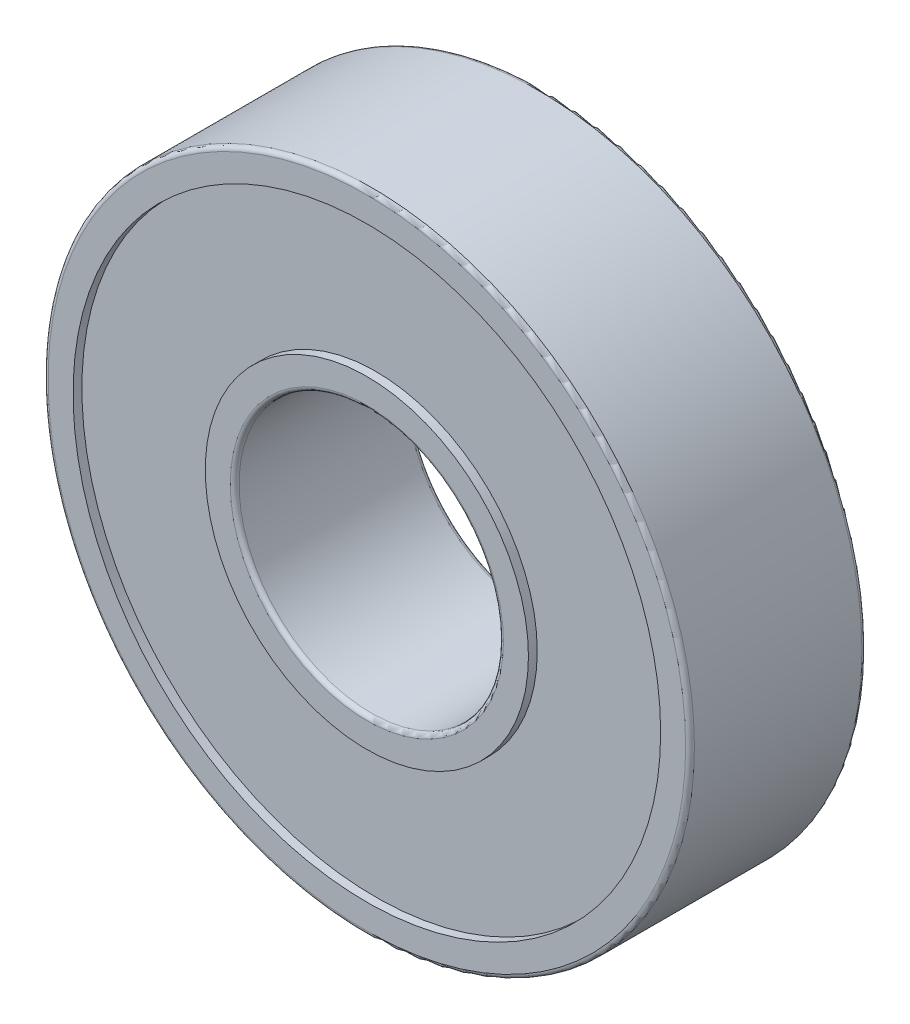
ISO-10303-21;
HEADER;
FILE_DESCRIPTION(('STEP AP214'),'2;1');
FILE_NAME('part.step','',(''),(''),'','','');
FILE_SCHEMA(('AUTOMOTIVE_DESIGN { 1 0 10303 214 1 1 1 1 }'));
ENDSEC;
DATA;
#1=APPLICATION_CONTEXT('core data for automotive mechanical design processes');
#2=APPLICATION_PROTOCOL_DEFINITION('international standard','automotive_design',2000,#1);
#3=PRODUCT_CONTEXT('',#1,'mechanical');
#4=PRODUCT('Part','Part','',(#3));
#5=PRODUCT_RELATED_PRODUCT_CATEGORY('part','',(#4));
#6=PRODUCT_DEFINITION_FORMATION('','',#4);
#7=PRODUCT_DEFINITION_CONTEXT('part definition',#1,'design');
#8=PRODUCT_DEFINITION('design','',#6,#7);
#9=PRODUCT_DEFINITION_SHAPE('','',#8);
#10=(LENGTH_UNIT() NAMED_UNIT(*) SI_UNIT(.MILLI.,.METRE.));
#11=(NAMED_UNIT(*) PLANE_ANGLE_UNIT() SI_UNIT($,.RADIAN.));
#12=(NAMED_UNIT(*) SI_UNIT($,.STERADIAN.) SOLID_ANGLE_UNIT());
#13=UNCERTAINTY_MEASURE_WITH_UNIT(LENGTH_MEASURE(1.E-05),#10,'distance_accuracy_value','');
#14=(GEOMETRIC_REPRESENTATION_CONTEXT(3) GLOBAL_UNCERTAINTY_ASSIGNED_CONTEXT((#13)) GLOBAL_UNIT_ASSIGNED_CONTEXT((#10,
#11,#12)) REPRESENTATION_CONTEXT('',''));
#15=CARTESIAN_POINT('',(0.,0.,0.));
#16=DIRECTION('',(0.,0.,1.));
#17=DIRECTION('',(1.,0.,0.));
#18=AXIS2_PLACEMENT_3D('',#15,#16,#17);
#19=CARTESIAN_POINT('',(0.,0.,0.));
#20=DIRECTION('',(0.,0.,1.));
#21=DIRECTION('',(1.,0.,0.));
#22=AXIS2_PLACEMENT_3D('',#19,#20,#21);
#23=PLANE('',#22);
#24=CARTESIAN_POINT('',(0.,0.,0.));
#25=DIRECTION('',(0.,0.,1.));
#26=DIRECTION('',(1.,0.,0.));
#27=AXIS2_PLACEMENT_3D('',#24,#25,#26);
#28=CIRCLE('',#27,4.65);
#29=CARTESIAN_POINT('',(4.65,0.,0.));
#30=VERTEX_POINT('',#29);
#31=EDGE_CURVE('E62',#30,#30,#28,.T.);
#32=ORIENTED_EDGE('',*,*,#31,.T.);
#33=EDGE_LOOP('',(#32));
#34=FACE_BOUND('',#33,.T.);
#35=CARTESIAN_POINT('',(0.,0.,0.));
#36=DIRECTION('',(0.,0.,1.));
#37=DIRECTION('',(1.,0.,0.));
#38=AXIS2_PLACEMENT_3D('',#35,#36,#37);
#39=CIRCLE('',#38,5.5);
#40=CARTESIAN_POINT('',(5.5,0.,0.));
#41=VERTEX_POINT('',#40);
#42=EDGE_CURVE('E84',#41,#41,#39,.T.);
#43=ORIENTED_EDGE('',*,*,#42,.F.);
#44=EDGE_LOOP('',(#43));
#45=FACE_BOUND('',#44,.T.);
#46=ADVANCED_FACE('F33',(#34,#45),#23,.F.);
#47=CARTESIAN_POINT('',(0.,0.,6.));
#48=DIRECTION('',(0.,0.,1.));
#49=DIRECTION('',(1.,0.,0.));
#50=AXIS2_PLACEMENT_3D('',#47,#48,#49);
#51=PLANE('',#50);
#52=CARTESIAN_POINT('',(0.,0.,6.));
#53=DIRECTION('',(0.,0.,1.));
#54=DIRECTION('',(1.,0.,0.));
#55=AXIS2_PLACEMENT_3D('',#52,#53,#54);
#56=CIRCLE('',#55,4.65);
#57=CARTESIAN_POINT('',(4.65,0.,6.));
#58=VERTEX_POINT('',#57);
#59=EDGE_CURVE('E40',#58,#58,#56,.F.);
#60=ORIENTED_EDGE('',*,*,#59,.T.);
#61=EDGE_LOOP('',(#60));
#62=FACE_BOUND('',#61,.T.);
#63=CARTESIAN_POINT('',(0.,0.,6.));
#64=DIRECTION('',(0.,0.,1.));
#65=DIRECTION('',(1.,0.,0.));
#66=AXIS2_PLACEMENT_3D('',#63,#64,#65);
#67=CIRCLE('',#66,5.5);
#68=CARTESIAN_POINT('',(5.5,0.,6.));
#69=VERTEX_POINT('',#68);
#70=EDGE_CURVE('E72',#69,#69,#67,.T.);
#71=ORIENTED_EDGE('',*,*,#70,.T.);
#72=EDGE_LOOP('',(#71));
#73=FACE_BOUND('',#72,.T.);
#74=ADVANCED_FACE('F101',(#62,#73),#51,.T.);
#75=CARTESIAN_POINT('',(0.,0.,6.));
#76=DIRECTION('',(0.,0.,1.));
#77=DIRECTION('',(1.,0.,0.));
#78=AXIS2_PLACEMENT_3D('',#75,#76,#77);
#79=CIRCLE('',#78,10.85);
#80=CARTESIAN_POINT('',(10.85,0.,6.));
#81=VERTEX_POINT('',#80);
#82=EDGE_CURVE('E10',#81,#81,#79,.T.);
#83=ORIENTED_EDGE('',*,*,#82,.T.);
#84=EDGE_LOOP('',(#83));
#85=FACE_BOUND('',#84,.T.);
#86=CARTESIAN_POINT('',(0.,0.,6.));
#87=DIRECTION('',(0.,0.,1.));
#88=DIRECTION('',(1.,0.,0.));
#89=AXIS2_PLACEMENT_3D('',#86,#87,#88);
#90=CIRCLE('',#89,10.);
#91=CARTESIAN_POINT('',(10.,0.,6.));
#92=VERTEX_POINT('',#91);
#93=EDGE_CURVE('E66',#92,#92,#90,.T.);
#94=ORIENTED_EDGE('',*,*,#93,.F.);
#95=EDGE_LOOP('',(#94));
#96=FACE_BOUND('',#95,.T.);
#97=ADVANCED_FACE('F108',(#85,#96),#51,.T.);
#98=CARTESIAN_POINT('',(0.,0.,0.));
#99=DIRECTION('',(0.,0.,1.));
#100=DIRECTION('',(1.,0.,0.));
#101=AXIS2_PLACEMENT_3D('',#98,#99,#100);
#102=CIRCLE('',#101,10.85);
#103=CARTESIAN_POINT('',(10.85,0.,0.));
#104=VERTEX_POINT('',#103);
#105=EDGE_CURVE('E44',#104,#104,#102,.F.);
#106=ORIENTED_EDGE('',*,*,#105,.T.);
#107=EDGE_LOOP('',(#106));
#108=FACE_BOUND('',#107,.T.);
#109=CARTESIAN_POINT('',(0.,0.,0.));
#110=DIRECTION('',(0.,0.,1.));
#111=DIRECTION('',(1.,0.,0.));
#112=AXIS2_PLACEMENT_3D('',#109,#110,#111);
#113=CIRCLE('',#112,10.);
#114=CARTESIAN_POINT('',(10.,0.,0.));
#115=VERTEX_POINT('',#114);
#116=EDGE_CURVE('E78',#115,#115,#113,.T.);
#117=ORIENTED_EDGE('',*,*,#116,.T.);
#118=EDGE_LOOP('',(#117));
#119=FACE_BOUND('',#118,.T.);
#120=ADVANCED_FACE('F104',(#108,#119),#23,.F.);
#121=CARTESIAN_POINT('',(0.,0.,6.));
#122=DIRECTION('',(0.,0.,-1.));
#123=DIRECTION('',(-1.,0.,0.));
#124=AXIS2_PLACEMENT_3D('',#121,#122,#123);
#125=CYLINDRICAL_SURFACE('',#124,11.);
#126=CARTESIAN_POINT('',(0.,0.,0.15));
#127=DIRECTION('',(0.,0.,1.));
#128=DIRECTION('',(1.,0.,0.));
#129=AXIS2_PLACEMENT_3D('',#126,#127,#128);
#130=CIRCLE('',#129,11.);
#131=CARTESIAN_POINT('',(11.,0.,0.15));
#132=VERTEX_POINT('',#131);
#133=EDGE_CURVE('E48',#132,#132,#130,.T.);
#134=ORIENTED_EDGE('',*,*,#133,.T.);
#135=EDGE_LOOP('',(#134));
#136=FACE_BOUND('',#135,.T.);
#137=CARTESIAN_POINT('',(0.,0.,5.85));
#138=DIRECTION('',(0.,0.,1.));
#139=DIRECTION('',(1.,0.,0.));
#140=AXIS2_PLACEMENT_3D('',#137,#138,#139);
#141=CIRCLE('',#140,11.);
#142=CARTESIAN_POINT('',(11.,0.,5.85));
#143=VERTEX_POINT('',#142);
#144=EDGE_CURVE('E53',#143,#143,#141,.F.);
#145=ORIENTED_EDGE('',*,*,#144,.T.);
#146=EDGE_LOOP('',(#145));
#147=FACE_BOUND('',#146,.T.);
#148=ADVANCED_FACE('F112',(#136,#147),#125,.T.);
#149=CARTESIAN_POINT('',(0.,0.,6.));
#150=DIRECTION('',(0.,0.,-1.));
#151=DIRECTION('',(-1.,0.,0.));
#152=AXIS2_PLACEMENT_3D('',#149,#150,#151);
#153=CYLINDRICAL_SURFACE('',#152,4.5);
#154=CARTESIAN_POINT('',(0.,0.,0.15));
#155=DIRECTION('',(0.,0.,1.));
#156=DIRECTION('',(1.,0.,0.));
#157=AXIS2_PLACEMENT_3D('',#154,#155,#156);
#158=CIRCLE('',#157,4.5);
#159=CARTESIAN_POINT('',(4.5,0.,0.15));
#160=VERTEX_POINT('',#159);
#161=EDGE_CURVE('E56',#160,#160,#158,.F.);
#162=ORIENTED_EDGE('',*,*,#161,.T.);
#163=EDGE_LOOP('',(#162));
#164=FACE_BOUND('',#163,.T.);
#165=CARTESIAN_POINT('',(0.,0.,5.85));
#166=DIRECTION('',(0.,0.,1.));
#167=DIRECTION('',(1.,0.,0.));
#168=AXIS2_PLACEMENT_3D('',#165,#166,#167);
#169=CIRCLE('',#168,4.5);
#170=CARTESIAN_POINT('',(4.5,0.,5.85));
#171=VERTEX_POINT('',#170);
#172=EDGE_CURVE('E59',#171,#171,#169,.T.);
#173=ORIENTED_EDGE('',*,*,#172,.T.);
#174=EDGE_LOOP('',(#173));
#175=FACE_BOUND('',#174,.T.);
#176=ADVANCED_FACE('F118',(#164,#175),#153,.F.);
#177=CARTESIAN_POINT('',(0.,0.,5.7));
#178=DIRECTION('',(0.,0.,1.));
#179=DIRECTION('',(1.,0.,0.));
#180=AXIS2_PLACEMENT_3D('',#177,#178,#179);
#181=CYLINDRICAL_SURFACE('',#180,10.);
#182=CARTESIAN_POINT('',(0.,0.,5.7));
#183=DIRECTION('',(0.,0.,1.));
#184=DIRECTION('',(1.,0.,0.));
#185=AXIS2_PLACEMENT_3D('',#182,#183,#184);
#186=CIRCLE('',#185,10.);
#187=CARTESIAN_POINT('',(10.,0.,5.7));
#188=VERTEX_POINT('',#187);
#189=EDGE_CURVE('E65',#188,#188,#186,.T.);
#190=ORIENTED_EDGE('',*,*,#189,.F.);
#191=EDGE_LOOP('',(#190));
#192=FACE_BOUND('',#191,.T.);
#193=ORIENTED_EDGE('',*,*,#93,.T.);
#194=EDGE_LOOP('',(#193));
#195=FACE_BOUND('',#194,.T.);
#196=ADVANCED_FACE('F140',(#192,#195),#181,.F.);
#197=CARTESIAN_POINT('',(0.,0.,5.7));
#198=DIRECTION('',(0.,0.,1.));
#199=DIRECTION('',(1.,0.,0.));
#200=AXIS2_PLACEMENT_3D('',#197,#198,#199);
#201=PLANE('',#200);
#202=CARTESIAN_POINT('',(0.,0.,5.7));
#203=DIRECTION('',(0.,0.,1.));
#204=DIRECTION('',(1.,0.,0.));
#205=AXIS2_PLACEMENT_3D('',#202,#203,#204);
#206=CIRCLE('',#205,5.5);
#207=CARTESIAN_POINT('',(5.5,0.,5.7));
#208=VERTEX_POINT('',#207);
#209=EDGE_CURVE('E69',#208,#208,#206,.T.);
#210=ORIENTED_EDGE('',*,*,#209,.F.);
#211=EDGE_LOOP('',(#210));
#212=FACE_BOUND('',#211,.T.);
#213=ORIENTED_EDGE('',*,*,#189,.T.);
#214=EDGE_LOOP('',(#213));
#215=FACE_BOUND('',#214,.T.);
#216=ADVANCED_FACE('F136',(#212,#215),#201,.T.);
#217=CARTESIAN_POINT('',(0.,0.,5.7));
#218=DIRECTION('',(0.,0.,1.));
#219=DIRECTION('',(1.,0.,0.));
#220=AXIS2_PLACEMENT_3D('',#217,#218,#219);
#221=CYLINDRICAL_SURFACE('',#220,5.5);
#222=ORIENTED_EDGE('',*,*,#209,.T.);
#223=EDGE_LOOP('',(#222));
#224=FACE_BOUND('',#223,.T.);
#225=ORIENTED_EDGE('',*,*,#70,.F.);
#226=EDGE_LOOP('',(#225));
#227=FACE_BOUND('',#226,.T.);
#228=ADVANCED_FACE('F130',(#224,#227),#221,.T.);
#229=CARTESIAN_POINT('',(0.,0.,0.5));
#230=DIRECTION('',(0.,0.,1.));
#231=DIRECTION('',(1.,0.,0.));
#232=AXIS2_PLACEMENT_3D('',#229,#230,#231);
#233=PLANE('',#232);
#234=CARTESIAN_POINT('',(0.,0.,0.5));
#235=DIRECTION('',(0.,0.,1.));
#236=DIRECTION('',(1.,0.,0.));
#237=AXIS2_PLACEMENT_3D('',#234,#235,#236);
#238=CIRCLE('',#237,10.);
#239=CARTESIAN_POINT('',(10.,0.,0.5));
#240=VERTEX_POINT('',#239);
#241=EDGE_CURVE('E75',#240,#240,#238,.T.);
#242=ORIENTED_EDGE('',*,*,#241,.F.);
#243=EDGE_LOOP('',(#242));
#244=FACE_BOUND('',#243,.T.);
#245=CARTESIAN_POINT('',(0.,0.,0.5));
#246=DIRECTION('',(0.,0.,1.));
#247=DIRECTION('',(1.,0.,0.));
#248=AXIS2_PLACEMENT_3D('',#245,#246,#247);
#249=CIRCLE('',#248,5.5);
#250=CARTESIAN_POINT('',(5.5,0.,0.5));
#251=VERTEX_POINT('',#250);
#252=EDGE_CURVE('E81',#251,#251,#249,.T.);
#253=ORIENTED_EDGE('',*,*,#252,.T.);
#254=EDGE_LOOP('',(#253));
#255=FACE_BOUND('',#254,.T.);
#256=ADVANCED_FACE('F90',(#244,#255),#233,.F.);
#257=CARTESIAN_POINT('',(0.,0.,0.5));
#258=DIRECTION('',(0.,0.,-1.));
#259=DIRECTION('',(-1.,0.,0.));
#260=AXIS2_PLACEMENT_3D('',#257,#258,#259);
#261=CYLINDRICAL_SURFACE('',#260,10.);
#262=ORIENTED_EDGE('',*,*,#241,.T.);
#263=EDGE_LOOP('',(#262));
#264=FACE_BOUND('',#263,.T.);
#265=ORIENTED_EDGE('',*,*,#116,.F.);
#266=EDGE_LOOP('',(#265));
#267=FACE_BOUND('',#266,.T.);
#268=ADVANCED_FACE('F96',(#264,#267),#261,.F.);
#269=CARTESIAN_POINT('',(0.,0.,0.5));
#270=DIRECTION('',(0.,0.,-1.));
#271=DIRECTION('',(-1.,0.,0.));
#272=AXIS2_PLACEMENT_3D('',#269,#270,#271);
#273=CYLINDRICAL_SURFACE('',#272,5.5);
#274=ORIENTED_EDGE('',*,*,#252,.F.);
#275=EDGE_LOOP('',(#274));
#276=FACE_BOUND('',#275,.T.);
#277=ORIENTED_EDGE('',*,*,#42,.T.);
#278=EDGE_LOOP('',(#277));
#279=FACE_BOUND('',#278,.T.);
#280=ADVANCED_FACE('F92',(#276,#279),#273,.T.);
#281=CARTESIAN_POINT('',(0.,0.,0.15));
#282=DIRECTION('',(0.,0.,1.));
#283=DIRECTION('',(1.,0.,0.));
#284=AXIS2_PLACEMENT_3D('',#281,#282,#283);
#285=TOROIDAL_SURFACE('',#284,4.65,0.15);
#286=ORIENTED_EDGE('',*,*,#161,.F.);
#287=EDGE_LOOP('',(#286));
#288=FACE_BOUND('',#287,.T.);
#289=ORIENTED_EDGE('',*,*,#31,.F.);
#290=EDGE_LOOP('',(#289));
#291=FACE_BOUND('',#290,.T.);
#292=ADVANCED_FACE('F95',(#288,#291),#285,.T.);
#293=CARTESIAN_POINT('',(0.,0.,0.15));
#294=DIRECTION('',(0.,0.,1.));
#295=DIRECTION('',(1.,0.,0.));
#296=AXIS2_PLACEMENT_3D('',#293,#294,#295);
#297=TOROIDAL_SURFACE('',#296,10.85,0.15);
#298=ORIENTED_EDGE('',*,*,#105,.F.);
#299=EDGE_LOOP('',(#298));
#300=FACE_BOUND('',#299,.T.);
#301=ORIENTED_EDGE('',*,*,#133,.F.);
#302=EDGE_LOOP('',(#301));
#303=FACE_BOUND('',#302,.T.);
#304=ADVANCED_FACE('F155',(#300,#303),#297,.T.);
#305=CARTESIAN_POINT('',(0.,0.,5.85));
#306=DIRECTION('',(0.,0.,1.));
#307=DIRECTION('',(1.,0.,0.));
#308=AXIS2_PLACEMENT_3D('',#305,#306,#307);
#309=TOROIDAL_SURFACE('',#308,4.65,0.15);
#310=ORIENTED_EDGE('',*,*,#59,.F.);
#311=EDGE_LOOP('',(#310));
#312=FACE_BOUND('',#311,.T.);
#313=ORIENTED_EDGE('',*,*,#172,.F.);
#314=EDGE_LOOP('',(#313));
#315=FACE_BOUND('',#314,.T.);
#316=ADVANCED_FACE('F153',(#312,#315),#309,.T.);
#317=CARTESIAN_POINT('',(0.,0.,5.85));
#318=DIRECTION('',(0.,0.,1.));
#319=DIRECTION('',(1.,0.,0.));
#320=AXIS2_PLACEMENT_3D('',#317,#318,#319);
#321=TOROIDAL_SURFACE('',#320,10.85,0.15);
#322=ORIENTED_EDGE('',*,*,#144,.F.);
#323=EDGE_LOOP('',(#322));
#324=FACE_BOUND('',#323,.T.);
#325=ORIENTED_EDGE('',*,*,#82,.F.);
#326=EDGE_LOOP('',(#325));
#327=FACE_BOUND('',#326,.T.);
#328=ADVANCED_FACE('F35',(#324,#327),#321,.T.);
#329=CLOSED_SHELL('',(#46,#74,#97,#120,#148,#176,#196,#216,#228,#256,#268,#280,#292,#304,#316,#328));
#330=MANIFOLD_SOLID_BREP('B2',#329);
#331=ADVANCED_BREP_SHAPE_REPRESENTATION('',(#18,#330),#14);
#332=SHAPE_DEFINITION_REPRESENTATION(#9,#331);
ENDSEC;
END-ISO-10303-21;
